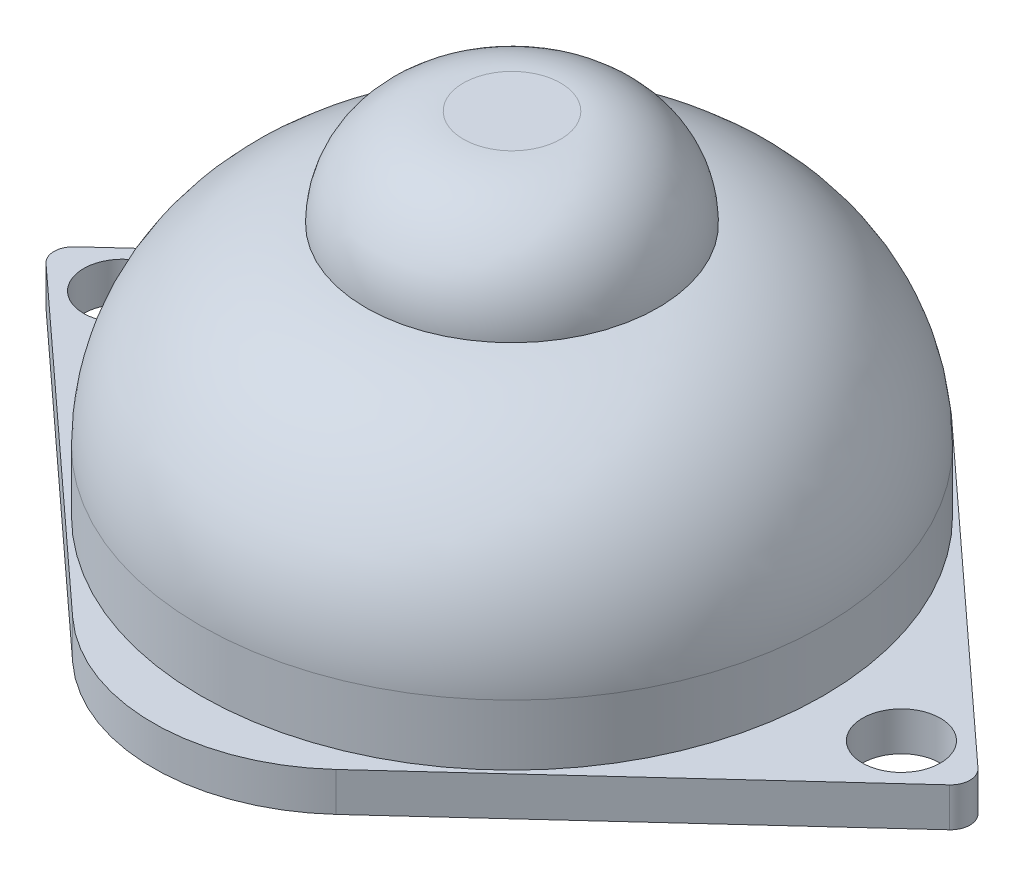
ISO-10303-21;
HEADER;
FILE_DESCRIPTION(('STEP AP214'),'2;1');
FILE_NAME('part.step','',(''),(''),'','','');
FILE_SCHEMA(('AUTOMOTIVE_DESIGN { 1 0 10303 214 1 1 1 1 }'));
ENDSEC;
DATA;
#1=APPLICATION_CONTEXT('core data for automotive mechanical design processes');
#2=APPLICATION_PROTOCOL_DEFINITION('international standard','automotive_design',2000,#1);
#3=PRODUCT_CONTEXT('',#1,'mechanical');
#4=PRODUCT('Part','Part','',(#3));
#5=PRODUCT_RELATED_PRODUCT_CATEGORY('part','',(#4));
#6=PRODUCT_DEFINITION_FORMATION('','',#4);
#7=PRODUCT_DEFINITION_CONTEXT('part definition',#1,'design');
#8=PRODUCT_DEFINITION('design','',#6,#7);
#9=PRODUCT_DEFINITION_SHAPE('','',#8);
#10=(LENGTH_UNIT() NAMED_UNIT(*) SI_UNIT(.MILLI.,.METRE.));
#11=(NAMED_UNIT(*) PLANE_ANGLE_UNIT() SI_UNIT($,.RADIAN.));
#12=(NAMED_UNIT(*) SI_UNIT($,.STERADIAN.) SOLID_ANGLE_UNIT());
#13=UNCERTAINTY_MEASURE_WITH_UNIT(LENGTH_MEASURE(1.E-05),#10,'distance_accuracy_value','');
#14=(GEOMETRIC_REPRESENTATION_CONTEXT(3) GLOBAL_UNCERTAINTY_ASSIGNED_CONTEXT((#13)) GLOBAL_UNIT_ASSIGNED_CONTEXT((#10,
#11,#12)) REPRESENTATION_CONTEXT('',''));
#15=CARTESIAN_POINT('',(0.,0.,0.));
#16=DIRECTION('',(0.,0.,1.));
#17=DIRECTION('',(1.,0.,0.));
#18=AXIS2_PLACEMENT_3D('',#15,#16,#17);
#19=CARTESIAN_POINT('',(0.,13.,0.));
#20=DIRECTION('',(0.,-1.,0.));
#21=DIRECTION('',(0.,0.,-1.));
#22=AXIS2_PLACEMENT_3D('',#19,#20,#21);
#23=CYLINDRICAL_SURFACE('',#22,16.);
#24=CARTESIAN_POINT('',(0.,3.1131400333574,0.));
#25=DIRECTION('',(0.,1.,0.));
#26=DIRECTION('',(0.,0.,1.));
#27=AXIS2_PLACEMENT_3D('',#24,#25,#26);
#28=CIRCLE('',#27,16.);
#29=CARTESIAN_POINT('',(0.,3.1131400333574,-16.));
#30=VERTEX_POINT('',#29);
#31=EDGE_CURVE('E51',#30,#30,#28,.F.);
#32=CARTESIAN_POINT('',(0.,0.,0.));
#33=DIRECTION('',(0.,1.,0.));
#34=DIRECTION('',(0.,0.,1.));
#35=AXIS2_PLACEMENT_3D('',#32,#33,#34);
#36=CIRCLE('',#35,16.);
#37=CARTESIAN_POINT('',(0.,0.,-16.));
#38=VERTEX_POINT('',#37);
#39=EDGE_CURVE('E190',#38,#38,#36,.T.);
#40=CARTESIAN_POINT('',(0.,3.1131400333574,-16.));
#41=CARTESIAN_POINT('',(0.,3.08071149134326,-16.));
#42=CARTESIAN_POINT('',(0.,3.04828294932912,-16.));
#43=CARTESIAN_POINT('',(0.,2.98342586530084,-16.));
#44=CARTESIAN_POINT('',(0.,2.9509973232867,-16.));
#45=CARTESIAN_POINT('',(0.,2.88614023925842,-16.));
#46=CARTESIAN_POINT('',(0.,2.85371169724428,-16.));
#47=CARTESIAN_POINT('',(0.,2.788854613216,-16.));
#48=CARTESIAN_POINT('',(0.,2.75642607120187,-16.));
#49=CARTESIAN_POINT('',(0.,2.69156898717359,-16.));
#50=CARTESIAN_POINT('',(0.,2.65914044515945,-16.));
#51=CARTESIAN_POINT('',(0.,2.59428336113117,-16.));
#52=CARTESIAN_POINT('',(0.,2.56185481911703,-16.));
#53=CARTESIAN_POINT('',(0.,2.49699773508875,-16.));
#54=CARTESIAN_POINT('',(0.,2.46456919307461,-16.));
#55=CARTESIAN_POINT('',(0.,2.39971210904633,-16.));
#56=CARTESIAN_POINT('',(0.,2.36728356703219,-16.));
#57=CARTESIAN_POINT('',(0.,2.30242648300391,-16.));
#58=CARTESIAN_POINT('',(0.,2.26999794098977,-16.));
#59=CARTESIAN_POINT('',(0.,2.20514085696149,-16.));
#60=CARTESIAN_POINT('',(0.,2.17271231494735,-16.));
#61=CARTESIAN_POINT('',(0.,2.10785523091907,-16.));
#62=CARTESIAN_POINT('',(0.,2.07542668890493,-16.));
#63=CARTESIAN_POINT('',(0.,2.01056960487665,-16.));
#64=CARTESIAN_POINT('',(0.,1.97814106286251,-16.));
#65=CARTESIAN_POINT('',(0.,1.91328397883424,-16.));
#66=CARTESIAN_POINT('',(0.,1.8808554368201,-16.));
#67=CARTESIAN_POINT('',(0.,1.81599835279182,-16.));
#68=CARTESIAN_POINT('',(0.,1.78356981077768,-16.));
#69=CARTESIAN_POINT('',(0.,1.7187127267494,-16.));
#70=CARTESIAN_POINT('',(0.,1.68628418473526,-16.));
#71=CARTESIAN_POINT('',(0.,1.62142710070698,-16.));
#72=CARTESIAN_POINT('',(0.,1.58899855869284,-16.));
#73=CARTESIAN_POINT('',(0.,1.52414147466456,-16.));
#74=CARTESIAN_POINT('',(0.,1.49171293265042,-16.));
#75=CARTESIAN_POINT('',(0.,1.42685584862214,-16.));
#76=CARTESIAN_POINT('',(0.,1.394427306608,-16.));
#77=CARTESIAN_POINT('',(0.,1.32957022257972,-16.));
#78=CARTESIAN_POINT('',(0.,1.29714168056558,-16.));
#79=CARTESIAN_POINT('',(0.,1.2322845965373,-16.));
#80=CARTESIAN_POINT('',(0.,1.19985605452316,-16.));
#81=CARTESIAN_POINT('',(0.,1.13499897049489,-16.));
#82=CARTESIAN_POINT('',(0.,1.10257042848075,-16.));
#83=CARTESIAN_POINT('',(0.,1.03771334445247,-16.));
#84=CARTESIAN_POINT('',(0.,1.00528480243833,-16.));
#85=CARTESIAN_POINT('',(0.,0.940427718410047,-16.));
#86=CARTESIAN_POINT('',(0.,0.907999176395908,-16.));
#87=CARTESIAN_POINT('',(0.,0.843142092367629,-16.));
#88=CARTESIAN_POINT('',(0.,0.81071355035349,-16.));
#89=CARTESIAN_POINT('',(0.,0.745856466325211,-16.));
#90=CARTESIAN_POINT('',(0.,0.713427924311071,-16.));
#91=CARTESIAN_POINT('',(0.,0.648570840282792,-16.));
#92=CARTESIAN_POINT('',(0.,0.616142298268653,-16.));
#93=CARTESIAN_POINT('',(0.,0.551285214240373,-16.));
#94=CARTESIAN_POINT('',(0.,0.518856672226233,-16.));
#95=CARTESIAN_POINT('',(0.,0.453999588197954,-16.));
#96=CARTESIAN_POINT('',(0.,0.421571046183815,-16.));
#97=CARTESIAN_POINT('',(0.,0.356713962155536,-16.));
#98=CARTESIAN_POINT('',(0.,0.324285420141396,-16.));
#99=CARTESIAN_POINT('',(0.,0.259428336113117,-16.));
#100=CARTESIAN_POINT('',(0.,0.226999794098977,-16.));
#101=CARTESIAN_POINT('',(0.,0.162142710070697,-16.));
#102=CARTESIAN_POINT('',(0.,0.129714168056558,-16.));
#103=CARTESIAN_POINT('',(0.,0.0648570840282789,-16.));
#104=CARTESIAN_POINT('',(0.,0.0324285420141395,-16.));
#105=CARTESIAN_POINT('',(0.,0.,-16.));
#106=B_SPLINE_CURVE_WITH_KNOTS('',3,(#40,#41,#42,#43,#44,#45,#46,#47,#48,#49,#50,#51,#52,#53,
#54,#55,#56,#57,#58,#59,#60,#61,#62,#63,#64,#65,#66,#67,#68,#69,#70,#71,#72,#73,#74,#75,#76,#77,
#78,#79,#80,#81,#82,#83,#84,#85,#86,#87,#88,#89,#90,#91,#92,#93,#94,#95,#96,#97,#98,#99,#100,
#101,#102,#103,#104,#105),.UNSPECIFIED.,.F.,.F.,(4,2,2,2,2,2,2,2,2,2,2,2,2,2,2,2,2,2,2,2,2,2,2,
2,2,2,2,2,2,2,2,2,4),(0.,0.0972856260424183,0.194571252084837,0.291856878127257,
0.389142504169675,0.486428130212093,0.583713756254513,0.680999382296932,0.77828500833935,
0.875570634381768,0.972856260424187,1.07014188646661,1.16742751250903,1.26471313855144,
1.36199876459386,1.45928439063628,1.5565700166787,1.65385564272112,1.75114126876354,
1.84842689480596,1.94571252084838,2.04299814689079,2.14028377293321,2.23756939897563,
2.33485502501805,2.43214065106047,2.52942627710289,2.62671190314531,2.72399752918773,
2.82128315523014,2.91856878127256,3.01585440731498,3.1131400333574),.UNSPECIFIED.);
#107=EDGE_CURVE('BSEAM41',#30,#38,#106,.T.);
#108=ORIENTED_EDGE('',*,*,#31,.T.);
#109=ORIENTED_EDGE('',*,*,#39,.T.);
#110=ORIENTED_EDGE('',*,*,#107,.T.);
#111=ORIENTED_EDGE('',*,*,#107,.F.);
#112=EDGE_LOOP('',(#108,#110,#109,#111));
#113=FACE_BOUND('',#112,.T.);
#114=ADVANCED_FACE('F41',(#113),#23,.T.);
#115=CARTESIAN_POINT('',(0.,18.,0.));
#116=DIRECTION('',(0.,1.,0.));
#117=DIRECTION('',(0.,0.,1.));
#118=AXIS2_PLACEMENT_3D('',#115,#116,#117);
#119=PLANE('',#118);
#120=CARTESIAN_POINT('',(0.,18.,0.));
#121=DIRECTION('',(0.,1.,0.));
#122=DIRECTION('',(0.,0.,1.));
#123=AXIS2_PLACEMENT_3D('',#120,#121,#122);
#124=CIRCLE('',#123,2.5);
#125=CARTESIAN_POINT('',(0.,18.,2.5));
#126=VERTEX_POINT('',#125);
#127=EDGE_CURVE('E11',#126,#126,#124,.T.);
#128=ORIENTED_EDGE('',*,*,#127,.T.);
#129=EDGE_LOOP('',(#128));
#130=FACE_BOUND('',#129,.T.);
#131=ADVANCED_FACE('F206',(#130),#119,.T.);
#132=CARTESIAN_POINT('',(0.,3.11314003335741,0.));
#133=DIRECTION('',(0.,1.,0.));
#134=DIRECTION('',(0.,0.,1.));
#135=AXIS2_PLACEMENT_3D('',#132,#133,#134);
#136=DEGENERATE_TOROIDAL_SURFACE('',#135,6.,10.,.T.);
#137=ORIENTED_EDGE('',*,*,#31,.F.);
#138=EDGE_LOOP('',(#137));
#139=FACE_BOUND('',#138,.T.);
#140=CARTESIAN_POINT('',(0.,13.,0.));
#141=DIRECTION('',(0.,1.,0.));
#142=DIRECTION('',(0.,0.,1.));
#143=AXIS2_PLACEMENT_3D('',#140,#141,#142);
#144=CIRCLE('',#143,7.5);
#145=CARTESIAN_POINT('',(0.,13.,7.5));
#146=VERTEX_POINT('',#145);
#147=EDGE_CURVE('E191',#146,#146,#144,.T.);
#148=ORIENTED_EDGE('',*,*,#147,.F.);
#149=EDGE_LOOP('',(#148));
#150=FACE_BOUND('',#149,.T.);
#151=ADVANCED_FACE('F203',(#139,#150),#136,.T.);
#152=CARTESIAN_POINT('',(0.,13.,0.));
#153=DIRECTION('',(0.,1.,0.));
#154=DIRECTION('',(0.,0.,1.));
#155=AXIS2_PLACEMENT_3D('',#152,#153,#154);
#156=DEGENERATE_TOROIDAL_SURFACE('',#155,2.5,5.,.T.);
#157=ORIENTED_EDGE('',*,*,#147,.T.);
#158=EDGE_LOOP('',(#157));
#159=FACE_BOUND('',#158,.T.);
#160=ORIENTED_EDGE('',*,*,#127,.F.);
#161=EDGE_LOOP('',(#160));
#162=FACE_BOUND('',#161,.T.);
#163=ADVANCED_FACE('F43',(#159,#162),#156,.T.);
#164=CARTESIAN_POINT('',(22.5201072185364,-2.,0.));
#165=DIRECTION('',(0.,-1.,0.));
#166=DIRECTION('',(0.,0.,-1.));
#167=AXIS2_PLACEMENT_3D('',#164,#165,#166);
#168=PLANE('',#167);
#169=CARTESIAN_POINT('',(20.,-2.,0.));
#170=DIRECTION('',(0.,-1.,0.));
#171=DIRECTION('',(0.,0.,-1.));
#172=AXIS2_PLACEMENT_3D('',#169,#170,#171);
#173=CIRCLE('',#172,2.);
#174=CARTESIAN_POINT('',(20.,-2.,-2.));
#175=VERTEX_POINT('',#174);
#176=EDGE_CURVE('E150',#175,#175,#173,.T.);
#177=ORIENTED_EDGE('',*,*,#176,.F.);
#178=EDGE_LOOP('',(#177));
#179=FACE_BOUND('',#178,.T.);
#180=CARTESIAN_POINT('',(22.5201072185364,-2.,0.));
#181=DIRECTION('',(0.,-1.,0.));
#182=DIRECTION('',(0.,0.,-1.));
#183=AXIS2_PLACEMENT_3D('',#180,#181,#182);
#184=CIRCLE('',#183,1.);
#185=CARTESIAN_POINT('',(23.1958318470537,-2.,-0.737154140200741));
#186=VERTEX_POINT('',#185);
#187=CARTESIAN_POINT('',(23.1958318470537,-2.,0.737154140200752));
#188=VERTEX_POINT('',#187);
#189=EDGE_CURVE('E168',#186,#188,#184,.T.);
#190=ORIENTED_EDGE('',*,*,#189,.T.);
#191=DIRECTION('',(-0.737154140200742,0.,0.675724628517346));
#192=VECTOR('',#191,1.);
#193=CARTESIAN_POINT('',(6.75724628517351,-2.,15.8058575719243));
#194=LINE('',#193,#192);
#195=CARTESIAN_POINT('',(6.75724628517351,-2.,15.8058575719243));
#196=VERTEX_POINT('',#195);
#197=EDGE_CURVE('E103',#188,#196,#194,.T.);
#198=ORIENTED_EDGE('',*,*,#197,.T.);
#199=CARTESIAN_POINT('',(0.,-2.,8.43431616991692));
#200=DIRECTION('',(0.,-1.,0.));
#201=DIRECTION('',(0.,0.,-1.));
#202=AXIS2_PLACEMENT_3D('',#199,#200,#201);
#203=CIRCLE('',#202,10.);
#204=CARTESIAN_POINT('',(-6.75724628517351,-2.,15.8058575719243));
#205=VERTEX_POINT('',#204);
#206=EDGE_CURVE('E286',#196,#205,#203,.T.);
#207=ORIENTED_EDGE('',*,*,#206,.T.);
#208=DIRECTION('',(-0.737154140200742,0.,-0.675724628517346));
#209=VECTOR('',#208,1.);
#210=CARTESIAN_POINT('',(-6.75724628517351,-2.,15.8058575719243));
#211=LINE('',#210,#209);
#212=CARTESIAN_POINT('',(-23.1958318470537,-2.,0.737154140200752));
#213=VERTEX_POINT('',#212);
#214=EDGE_CURVE('E289',#205,#213,#211,.T.);
#215=ORIENTED_EDGE('',*,*,#214,.T.);
#216=CARTESIAN_POINT('',(-22.5201072185364,-2.,0.));
#217=DIRECTION('',(0.,-1.,0.));
#218=DIRECTION('',(0.,0.,1.));
#219=AXIS2_PLACEMENT_3D('',#216,#217,#218);
#220=CIRCLE('',#219,1.);
#221=CARTESIAN_POINT('',(-23.1958318470537,-2.,-0.737154140200741));
#222=VERTEX_POINT('',#221);
#223=EDGE_CURVE('E123',#213,#222,#220,.T.);
#224=ORIENTED_EDGE('',*,*,#223,.T.);
#225=DIRECTION('',(0.737154140200742,0.,-0.675724628517346));
#226=VECTOR('',#225,1.);
#227=CARTESIAN_POINT('',(-6.75724628517351,-2.,-15.8058575719243));
#228=LINE('',#227,#226);
#229=CARTESIAN_POINT('',(-6.7572462851735,-2.,-15.8058575719243));
#230=VERTEX_POINT('',#229);
#231=EDGE_CURVE('E116',#222,#230,#228,.T.);
#232=ORIENTED_EDGE('',*,*,#231,.T.);
#233=CARTESIAN_POINT('',(0.,-2.,-8.43431616991691));
#234=DIRECTION('',(0.,-1.,0.));
#235=DIRECTION('',(0.,0.,1.));
#236=AXIS2_PLACEMENT_3D('',#233,#234,#235);
#237=CIRCLE('',#236,10.);
#238=CARTESIAN_POINT('',(6.75724628517352,-2.,-15.8058575719243));
#239=VERTEX_POINT('',#238);
#240=EDGE_CURVE('E121',#230,#239,#237,.T.);
#241=ORIENTED_EDGE('',*,*,#240,.T.);
#242=DIRECTION('',(0.737154140200741,0.,0.675724628517346));
#243=VECTOR('',#242,1.);
#244=CARTESIAN_POINT('',(6.75724628517352,-2.,-15.8058575719243));
#245=LINE('',#244,#243);
#246=EDGE_CURVE('E59',#239,#186,#245,.T.);
#247=ORIENTED_EDGE('',*,*,#246,.T.);
#248=EDGE_LOOP('',(#190,#198,#207,#215,#224,#232,#241,#247));
#249=FACE_BOUND('',#248,.T.);
#250=CARTESIAN_POINT('',(-20.,-2.,0.));
#251=DIRECTION('',(0.,-1.,0.));
#252=DIRECTION('',(0.,0.,1.));
#253=AXIS2_PLACEMENT_3D('',#250,#251,#252);
#254=CIRCLE('',#253,2.);
#255=CARTESIAN_POINT('',(-20.,-2.,2.));
#256=VERTEX_POINT('',#255);
#257=EDGE_CURVE('E265',#256,#256,#254,.T.);
#258=ORIENTED_EDGE('',*,*,#257,.F.);
#259=EDGE_LOOP('',(#258));
#260=FACE_BOUND('',#259,.T.);
#261=ADVANCED_FACE('F118',(#179,#249,#260),#168,.T.);
#262=CARTESIAN_POINT('',(22.5201072185364,0.,0.));
#263=DIRECTION('',(0.,-1.,0.));
#264=DIRECTION('',(0.,0.,-1.));
#265=AXIS2_PLACEMENT_3D('',#262,#263,#264);
#266=PLANE('',#265);
#267=ORIENTED_EDGE('',*,*,#39,.F.);
#268=EDGE_LOOP('',(#267));
#269=FACE_BOUND('',#268,.T.);
#270=CARTESIAN_POINT('',(22.5201072185364,0.,0.));
#271=DIRECTION('',(0.,-1.,0.));
#272=DIRECTION('',(0.,0.,-1.));
#273=AXIS2_PLACEMENT_3D('',#270,#271,#272);
#274=CIRCLE('',#273,1.);
#275=CARTESIAN_POINT('',(23.1958318470537,0.,-0.737154140200741));
#276=VERTEX_POINT('',#275);
#277=CARTESIAN_POINT('',(23.1958318470537,0.,0.737154140200752));
#278=VERTEX_POINT('',#277);
#279=EDGE_CURVE('E145',#276,#278,#274,.T.);
#280=ORIENTED_EDGE('',*,*,#279,.F.);
#281=DIRECTION('',(0.737154140200741,0.,0.675724628517346));
#282=VECTOR('',#281,1.);
#283=CARTESIAN_POINT('',(6.75724628517352,0.,-15.8058575719243));
#284=LINE('',#283,#282);
#285=CARTESIAN_POINT('',(6.75724628517352,0.,-15.8058575719243));
#286=VERTEX_POINT('',#285);
#287=EDGE_CURVE('E94',#286,#276,#284,.T.);
#288=ORIENTED_EDGE('',*,*,#287,.F.);
#289=CARTESIAN_POINT('',(0.,0.,-8.43431616991691));
#290=DIRECTION('',(0.,-1.,0.));
#291=DIRECTION('',(0.,0.,1.));
#292=AXIS2_PLACEMENT_3D('',#289,#290,#291);
#293=CIRCLE('',#292,10.);
#294=CARTESIAN_POINT('',(-6.7572462851735,0.,-15.8058575719243));
#295=VERTEX_POINT('',#294);
#296=EDGE_CURVE('E88',#295,#286,#293,.T.);
#297=ORIENTED_EDGE('',*,*,#296,.F.);
#298=DIRECTION('',(0.737154140200742,0.,-0.675724628517346));
#299=VECTOR('',#298,1.);
#300=CARTESIAN_POINT('',(-6.75724628517351,0.,-15.8058575719243));
#301=LINE('',#300,#299);
#302=CARTESIAN_POINT('',(-23.1958318470537,0.,-0.737154140200741));
#303=VERTEX_POINT('',#302);
#304=EDGE_CURVE('E132',#303,#295,#301,.T.);
#305=ORIENTED_EDGE('',*,*,#304,.F.);
#306=CARTESIAN_POINT('',(-22.5201072185364,0.,0.));
#307=DIRECTION('',(0.,-1.,0.));
#308=DIRECTION('',(0.,0.,1.));
#309=AXIS2_PLACEMENT_3D('',#306,#307,#308);
#310=CIRCLE('',#309,1.);
#311=CARTESIAN_POINT('',(-23.1958318470537,0.,0.737154140200752));
#312=VERTEX_POINT('',#311);
#313=EDGE_CURVE('E159',#312,#303,#310,.T.);
#314=ORIENTED_EDGE('',*,*,#313,.F.);
#315=DIRECTION('',(-0.737154140200742,0.,-0.675724628517346));
#316=VECTOR('',#315,1.);
#317=CARTESIAN_POINT('',(-6.75724628517351,0.,15.8058575719243));
#318=LINE('',#317,#316);
#319=CARTESIAN_POINT('',(-6.75724628517351,0.,15.8058575719243));
#320=VERTEX_POINT('',#319);
#321=EDGE_CURVE('E156',#320,#312,#318,.T.);
#322=ORIENTED_EDGE('',*,*,#321,.F.);
#323=CARTESIAN_POINT('',(0.,0.,8.43431616991692));
#324=DIRECTION('',(0.,-1.,0.));
#325=DIRECTION('',(0.,0.,-1.));
#326=AXIS2_PLACEMENT_3D('',#323,#324,#325);
#327=CIRCLE('',#326,10.);
#328=CARTESIAN_POINT('',(6.75724628517351,0.,15.8058575719243));
#329=VERTEX_POINT('',#328);
#330=EDGE_CURVE('E153',#329,#320,#327,.T.);
#331=ORIENTED_EDGE('',*,*,#330,.F.);
#332=DIRECTION('',(-0.737154140200742,0.,0.675724628517346));
#333=VECTOR('',#332,1.);
#334=CARTESIAN_POINT('',(6.75724628517351,0.,15.8058575719243));
#335=LINE('',#334,#333);
#336=EDGE_CURVE('E149',#278,#329,#335,.T.);
#337=ORIENTED_EDGE('',*,*,#336,.F.);
#338=EDGE_LOOP('',(#280,#288,#297,#305,#314,#322,#331,#337));
#339=FACE_BOUND('',#338,.T.);
#340=CARTESIAN_POINT('',(20.,0.,0.));
#341=DIRECTION('',(0.,-1.,0.));
#342=DIRECTION('',(0.,0.,-1.));
#343=AXIS2_PLACEMENT_3D('',#340,#341,#342);
#344=CIRCLE('',#343,2.);
#345=CARTESIAN_POINT('',(20.,0.,-2.));
#346=VERTEX_POINT('',#345);
#347=EDGE_CURVE('E273',#346,#346,#344,.T.);
#348=ORIENTED_EDGE('',*,*,#347,.T.);
#349=EDGE_LOOP('',(#348));
#350=FACE_BOUND('',#349,.T.);
#351=CARTESIAN_POINT('',(-20.,0.,0.));
#352=DIRECTION('',(0.,-1.,0.));
#353=DIRECTION('',(0.,0.,1.));
#354=AXIS2_PLACEMENT_3D('',#351,#352,#353);
#355=CIRCLE('',#354,2.);
#356=CARTESIAN_POINT('',(-20.,0.,2.));
#357=VERTEX_POINT('',#356);
#358=EDGE_CURVE('E268',#357,#357,#355,.T.);
#359=ORIENTED_EDGE('',*,*,#358,.T.);
#360=EDGE_LOOP('',(#359));
#361=FACE_BOUND('',#360,.T.);
#362=ADVANCED_FACE('F224',(#269,#339,#350,#361),#266,.F.);
#363=CARTESIAN_POINT('',(22.5201072185364,-2.,0.));
#364=DIRECTION('',(0.,1.,0.));
#365=DIRECTION('',(0.,0.,1.));
#366=AXIS2_PLACEMENT_3D('',#363,#364,#365);
#367=CYLINDRICAL_SURFACE('',#366,1.);
#368=ORIENTED_EDGE('',*,*,#279,.T.);
#369=DIRECTION('',(0.,1.,0.));
#370=VECTOR('',#369,1.);
#371=CARTESIAN_POINT('',(23.1958318470537,-2.,0.737154140200752));
#372=LINE('',#371,#370);
#373=EDGE_CURVE('E187',#188,#278,#372,.T.);
#374=ORIENTED_EDGE('',*,*,#373,.F.);
#375=ORIENTED_EDGE('',*,*,#189,.F.);
#376=DIRECTION('',(0.,1.,0.));
#377=VECTOR('',#376,1.);
#378=CARTESIAN_POINT('',(23.1958318470537,-2.,-0.737154140200741));
#379=LINE('',#378,#377);
#380=EDGE_CURVE('E141',#186,#276,#379,.T.);
#381=ORIENTED_EDGE('',*,*,#380,.T.);
#382=EDGE_LOOP('',(#368,#374,#375,#381));
#383=FACE_BOUND('',#382,.T.);
#384=ADVANCED_FACE('F220',(#383),#367,.T.);
#385=CARTESIAN_POINT('',(6.75724628517351,-2.,15.8058575719243));
#386=DIRECTION('',(-0.675724628517346,0.,-0.737154140200742));
#387=DIRECTION('',(-0.737154140200742,0.,0.675724628517346));
#388=AXIS2_PLACEMENT_3D('',#385,#386,#387);
#389=PLANE('',#388);
#390=ORIENTED_EDGE('',*,*,#336,.T.);
#391=DIRECTION('',(0.,1.,0.));
#392=VECTOR('',#391,1.);
#393=CARTESIAN_POINT('',(6.75724628517351,-2.,15.8058575719243));
#394=LINE('',#393,#392);
#395=EDGE_CURVE('E183',#196,#329,#394,.T.);
#396=ORIENTED_EDGE('',*,*,#395,.F.);
#397=ORIENTED_EDGE('',*,*,#197,.F.);
#398=ORIENTED_EDGE('',*,*,#373,.T.);
#399=EDGE_LOOP('',(#390,#396,#397,#398));
#400=FACE_BOUND('',#399,.T.);
#401=ADVANCED_FACE('F223',(#400),#389,.F.);
#402=CARTESIAN_POINT('',(0.,-2.,8.43431616991692));
#403=DIRECTION('',(0.,1.,0.));
#404=DIRECTION('',(0.,0.,1.));
#405=AXIS2_PLACEMENT_3D('',#402,#403,#404);
#406=CYLINDRICAL_SURFACE('',#405,10.);
#407=ORIENTED_EDGE('',*,*,#330,.T.);
#408=DIRECTION('',(0.,1.,0.));
#409=VECTOR('',#408,1.);
#410=CARTESIAN_POINT('',(-6.75724628517351,-2.,15.8058575719243));
#411=LINE('',#410,#409);
#412=EDGE_CURVE('E179',#205,#320,#411,.T.);
#413=ORIENTED_EDGE('',*,*,#412,.F.);
#414=ORIENTED_EDGE('',*,*,#206,.F.);
#415=ORIENTED_EDGE('',*,*,#395,.T.);
#416=EDGE_LOOP('',(#407,#413,#414,#415));
#417=FACE_BOUND('',#416,.T.);
#418=ADVANCED_FACE('F228',(#417),#406,.T.);
#419=CARTESIAN_POINT('',(-6.75724628517351,-2.,15.8058575719243));
#420=DIRECTION('',(0.675724628517346,0.,-0.737154140200742));
#421=DIRECTION('',(-0.737154140200742,0.,-0.675724628517346));
#422=AXIS2_PLACEMENT_3D('',#419,#420,#421);
#423=PLANE('',#422);
#424=ORIENTED_EDGE('',*,*,#321,.T.);
#425=DIRECTION('',(0.,1.,0.));
#426=VECTOR('',#425,1.);
#427=CARTESIAN_POINT('',(-23.1958318470537,-2.,0.737154140200752));
#428=LINE('',#427,#426);
#429=EDGE_CURVE('E175',#213,#312,#428,.T.);
#430=ORIENTED_EDGE('',*,*,#429,.F.);
#431=ORIENTED_EDGE('',*,*,#214,.F.);
#432=ORIENTED_EDGE('',*,*,#412,.T.);
#433=EDGE_LOOP('',(#424,#430,#431,#432));
#434=FACE_BOUND('',#433,.T.);
#435=ADVANCED_FACE('F231',(#434),#423,.F.);
#436=CARTESIAN_POINT('',(-22.5201072185364,-2.,0.));
#437=DIRECTION('',(0.,1.,0.));
#438=DIRECTION('',(0.,0.,1.));
#439=AXIS2_PLACEMENT_3D('',#436,#437,#438);
#440=CYLINDRICAL_SURFACE('',#439,1.);
#441=ORIENTED_EDGE('',*,*,#313,.T.);
#442=DIRECTION('',(0.,1.,0.));
#443=VECTOR('',#442,1.);
#444=CARTESIAN_POINT('',(-23.1958318470537,-2.,-0.737154140200741));
#445=LINE('',#444,#443);
#446=EDGE_CURVE('E134',#222,#303,#445,.T.);
#447=ORIENTED_EDGE('',*,*,#446,.F.);
#448=ORIENTED_EDGE('',*,*,#223,.F.);
#449=ORIENTED_EDGE('',*,*,#429,.T.);
#450=EDGE_LOOP('',(#441,#447,#448,#449));
#451=FACE_BOUND('',#450,.T.);
#452=ADVANCED_FACE('F235',(#451),#440,.T.);
#453=CARTESIAN_POINT('',(-6.75724628517351,-2.,-15.8058575719243));
#454=DIRECTION('',(0.675724628517346,0.,0.737154140200742));
#455=DIRECTION('',(0.737154140200742,0.,-0.675724628517346));
#456=AXIS2_PLACEMENT_3D('',#453,#454,#455);
#457=PLANE('',#456);
#458=ORIENTED_EDGE('',*,*,#304,.T.);
#459=DIRECTION('',(0.,1.,0.));
#460=VECTOR('',#459,1.);
#461=CARTESIAN_POINT('',(-6.7572462851735,-2.,-15.8058575719243));
#462=LINE('',#461,#460);
#463=EDGE_CURVE('E129',#230,#295,#462,.T.);
#464=ORIENTED_EDGE('',*,*,#463,.F.);
#465=ORIENTED_EDGE('',*,*,#231,.F.);
#466=ORIENTED_EDGE('',*,*,#446,.T.);
#467=EDGE_LOOP('',(#458,#464,#465,#466));
#468=FACE_BOUND('',#467,.T.);
#469=ADVANCED_FACE('F130',(#468),#457,.F.);
#470=CARTESIAN_POINT('',(0.,-2.,-8.43431616991691));
#471=DIRECTION('',(0.,1.,0.));
#472=DIRECTION('',(0.,0.,1.));
#473=AXIS2_PLACEMENT_3D('',#470,#471,#472);
#474=CYLINDRICAL_SURFACE('',#473,10.);
#475=ORIENTED_EDGE('',*,*,#296,.T.);
#476=DIRECTION('',(0.,1.,0.));
#477=VECTOR('',#476,1.);
#478=CARTESIAN_POINT('',(6.75724628517352,-2.,-15.8058575719243));
#479=LINE('',#478,#477);
#480=EDGE_CURVE('E135',#239,#286,#479,.T.);
#481=ORIENTED_EDGE('',*,*,#480,.F.);
#482=ORIENTED_EDGE('',*,*,#240,.F.);
#483=ORIENTED_EDGE('',*,*,#463,.T.);
#484=EDGE_LOOP('',(#475,#481,#482,#483));
#485=FACE_BOUND('',#484,.T.);
#486=ADVANCED_FACE('F137',(#485),#474,.T.);
#487=CARTESIAN_POINT('',(6.75724628517352,-2.,-15.8058575719243));
#488=DIRECTION('',(-0.675724628517346,0.,0.737154140200741));
#489=DIRECTION('',(0.737154140200741,0.,0.675724628517346));
#490=AXIS2_PLACEMENT_3D('',#487,#488,#489);
#491=PLANE('',#490);
#492=ORIENTED_EDGE('',*,*,#287,.T.);
#493=ORIENTED_EDGE('',*,*,#380,.F.);
#494=ORIENTED_EDGE('',*,*,#246,.F.);
#495=ORIENTED_EDGE('',*,*,#480,.T.);
#496=EDGE_LOOP('',(#492,#493,#494,#495));
#497=FACE_BOUND('',#496,.T.);
#498=ADVANCED_FACE('F244',(#497),#491,.F.);
#499=CARTESIAN_POINT('',(20.,-2.,0.));
#500=DIRECTION('',(0.,1.,0.));
#501=DIRECTION('',(0.,0.,1.));
#502=AXIS2_PLACEMENT_3D('',#499,#500,#501);
#503=CYLINDRICAL_SURFACE('',#502,2.);
#504=ORIENTED_EDGE('',*,*,#176,.T.);
#505=EDGE_LOOP('',(#504));
#506=FACE_BOUND('',#505,.T.);
#507=ORIENTED_EDGE('',*,*,#347,.F.);
#508=EDGE_LOOP('',(#507));
#509=FACE_BOUND('',#508,.T.);
#510=ADVANCED_FACE('F247',(#506,#509),#503,.F.);
#511=CARTESIAN_POINT('',(-20.,-2.,0.));
#512=DIRECTION('',(0.,1.,0.));
#513=DIRECTION('',(0.,0.,1.));
#514=AXIS2_PLACEMENT_3D('',#511,#512,#513);
#515=CYLINDRICAL_SURFACE('',#514,2.);
#516=ORIENTED_EDGE('',*,*,#257,.T.);
#517=EDGE_LOOP('',(#516));
#518=FACE_BOUND('',#517,.T.);
#519=ORIENTED_EDGE('',*,*,#358,.F.);
#520=EDGE_LOOP('',(#519));
#521=FACE_BOUND('',#520,.T.);
#522=ADVANCED_FACE('F256',(#518,#521),#515,.F.);
#523=CLOSED_SHELL('',(#114,#131,#151,#163,#261,#362,#384,#401,#418,#435,#452,#469,#486,#498,
#510,#522));
#524=MANIFOLD_SOLID_BREP('B2',#523);
#525=ADVANCED_BREP_SHAPE_REPRESENTATION('',(#18,#524),#14);
#526=SHAPE_DEFINITION_REPRESENTATION(#9,#525);
ENDSEC;
END-ISO-10303-21;
